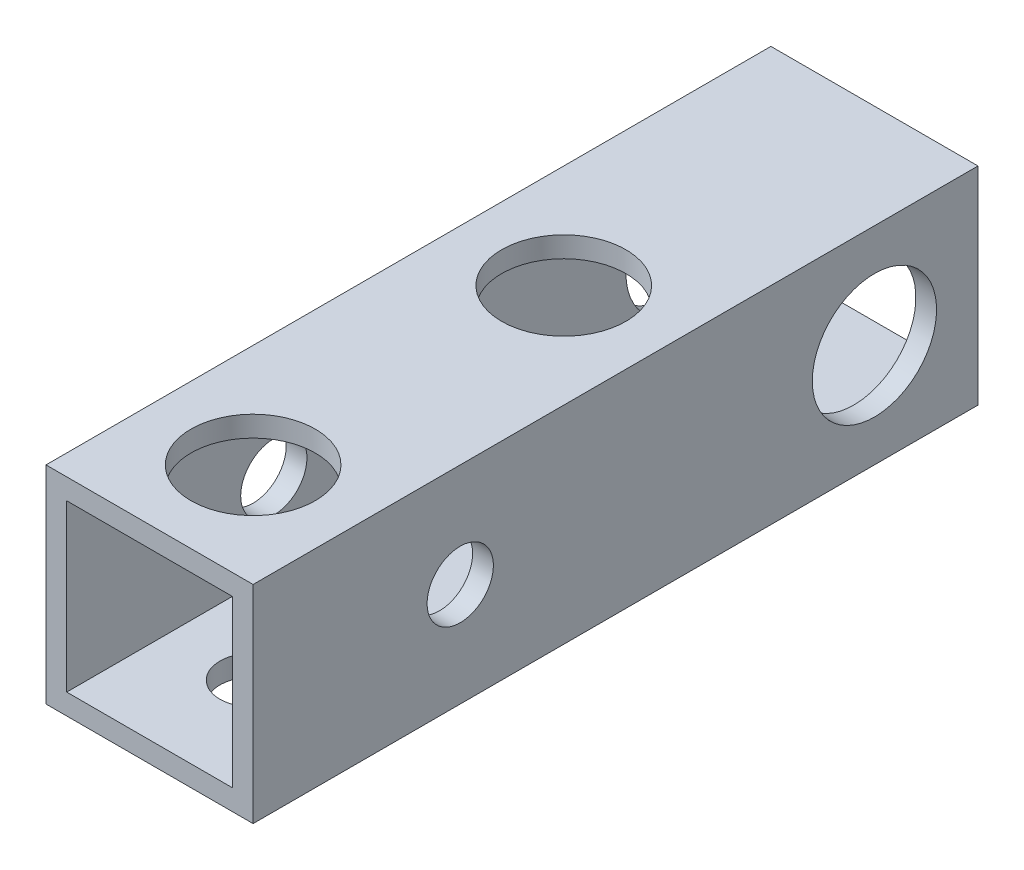
ISO-10303-21;
HEADER;
FILE_DESCRIPTION(('STEP AP214'),'2;1');
FILE_NAME('part.step','',(''),(''),'','','');
FILE_SCHEMA(('AUTOMOTIVE_DESIGN { 1 0 10303 214 1 1 1 1 }'));
ENDSEC;
DATA;
#1=APPLICATION_CONTEXT('core data for automotive mechanical design processes');
#2=APPLICATION_PROTOCOL_DEFINITION('international standard','automotive_design',2000,#1);
#3=PRODUCT_CONTEXT('',#1,'mechanical');
#4=PRODUCT('Part','Part','',(#3));
#5=PRODUCT_RELATED_PRODUCT_CATEGORY('part','',(#4));
#6=PRODUCT_DEFINITION_FORMATION('','',#4);
#7=PRODUCT_DEFINITION_CONTEXT('part definition',#1,'design');
#8=PRODUCT_DEFINITION('design','',#6,#7);
#9=PRODUCT_DEFINITION_SHAPE('','',#8);
#10=(LENGTH_UNIT() NAMED_UNIT(*) SI_UNIT(.MILLI.,.METRE.));
#11=(NAMED_UNIT(*) PLANE_ANGLE_UNIT() SI_UNIT($,.RADIAN.));
#12=(NAMED_UNIT(*) SI_UNIT($,.STERADIAN.) SOLID_ANGLE_UNIT());
#13=UNCERTAINTY_MEASURE_WITH_UNIT(LENGTH_MEASURE(1.E-05),#10,'distance_accuracy_value','');
#14=(GEOMETRIC_REPRESENTATION_CONTEXT(3) GLOBAL_UNCERTAINTY_ASSIGNED_CONTEXT((#13)) GLOBAL_UNIT_ASSIGNED_CONTEXT((#10,
#11,#12)) REPRESENTATION_CONTEXT('',''));
#15=CARTESIAN_POINT('',(0.,0.,0.));
#16=DIRECTION('',(0.,0.,1.));
#17=DIRECTION('',(1.,0.,0.));
#18=AXIS2_PLACEMENT_3D('',#15,#16,#17);
#19=CARTESIAN_POINT('',(0.,0.,0.));
#20=DIRECTION('',(0.,0.,-1.));
#21=DIRECTION('',(-1.,0.,0.));
#22=AXIS2_PLACEMENT_3D('',#19,#20,#21);
#23=PLANE('',#22);
#24=DIRECTION('',(0.,1.,0.));
#25=VECTOR('',#24,1.);
#26=CARTESIAN_POINT('',(5.,-5.,0.));
#27=LINE('',#26,#25);
#28=CARTESIAN_POINT('',(5.,-5.,0.));
#29=VERTEX_POINT('',#28);
#30=CARTESIAN_POINT('',(5.,5.,0.));
#31=VERTEX_POINT('',#30);
#32=EDGE_CURVE('E194',#29,#31,#27,.T.);
#33=ORIENTED_EDGE('',*,*,#32,.F.);
#34=DIRECTION('',(1.,0.,0.));
#35=VECTOR('',#34,1.);
#36=CARTESIAN_POINT('',(-5.,-5.,0.));
#37=LINE('',#36,#35);
#38=CARTESIAN_POINT('',(-5.,-5.,0.));
#39=VERTEX_POINT('',#38);
#40=EDGE_CURVE('E114',#39,#29,#37,.T.);
#41=ORIENTED_EDGE('',*,*,#40,.F.);
#42=DIRECTION('',(0.,-1.,0.));
#43=VECTOR('',#42,1.);
#44=CARTESIAN_POINT('',(-5.,-5.,0.));
#45=LINE('',#44,#43);
#46=CARTESIAN_POINT('',(-5.,5.,0.));
#47=VERTEX_POINT('',#46);
#48=EDGE_CURVE('E120',#47,#39,#45,.T.);
#49=ORIENTED_EDGE('',*,*,#48,.F.);
#50=DIRECTION('',(-1.,0.,0.));
#51=VECTOR('',#50,1.);
#52=CARTESIAN_POINT('',(-5.,5.,0.));
#53=LINE('',#52,#51);
#54=EDGE_CURVE('E196',#31,#47,#53,.T.);
#55=ORIENTED_EDGE('',*,*,#54,.F.);
#56=EDGE_LOOP('',(#33,#41,#49,#55));
#57=FACE_BOUND('',#56,.T.);
#58=DIRECTION('',(-1.,0.,0.));
#59=VECTOR('',#58,1.);
#60=CARTESIAN_POINT('',(4.,4.,0.));
#61=LINE('',#60,#59);
#62=CARTESIAN_POINT('',(4.,4.,0.));
#63=VERTEX_POINT('',#62);
#64=CARTESIAN_POINT('',(-4.,4.,0.));
#65=VERTEX_POINT('',#64);
#66=EDGE_CURVE('E183',#63,#65,#61,.T.);
#67=ORIENTED_EDGE('',*,*,#66,.T.);
#68=DIRECTION('',(0.,-1.,0.));
#69=VECTOR('',#68,1.);
#70=CARTESIAN_POINT('',(-4.,-4.,0.));
#71=LINE('',#70,#69);
#72=CARTESIAN_POINT('',(-4.,-4.,0.));
#73=VERTEX_POINT('',#72);
#74=EDGE_CURVE('E174',#65,#73,#71,.T.);
#75=ORIENTED_EDGE('',*,*,#74,.T.);
#76=DIRECTION('',(1.,0.,0.));
#77=VECTOR('',#76,1.);
#78=CARTESIAN_POINT('',(4.,-4.,0.));
#79=LINE('',#78,#77);
#80=CARTESIAN_POINT('',(4.,-4.,0.));
#81=VERTEX_POINT('',#80);
#82=EDGE_CURVE('E177',#73,#81,#79,.T.);
#83=ORIENTED_EDGE('',*,*,#82,.T.);
#84=DIRECTION('',(0.,1.,0.));
#85=VECTOR('',#84,1.);
#86=CARTESIAN_POINT('',(4.,-4.,0.));
#87=LINE('',#86,#85);
#88=EDGE_CURVE('E180',#81,#63,#87,.T.);
#89=ORIENTED_EDGE('',*,*,#88,.T.);
#90=EDGE_LOOP('',(#67,#75,#83,#89));
#91=FACE_BOUND('',#90,.T.);
#92=ADVANCED_FACE('F34',(#57,#91),#23,.T.);
#93=CARTESIAN_POINT('',(5.,-5.,80.));
#94=DIRECTION('',(-1.,0.,0.));
#95=DIRECTION('',(0.,0.,1.));
#96=AXIS2_PLACEMENT_3D('',#93,#94,#95);
#97=PLANE('',#96);
#98=CARTESIAN_POINT('',(5.,0.,25.));
#99=DIRECTION('',(-1.,0.,0.));
#100=DIRECTION('',(0.,0.,1.));
#101=AXIS2_PLACEMENT_3D('',#98,#99,#100);
#102=CIRCLE('',#101,1.6);
#103=CARTESIAN_POINT('',(5.,0.,26.6));
#104=VERTEX_POINT('',#103);
#105=EDGE_CURVE('E139',#104,#104,#102,.T.);
#106=ORIENTED_EDGE('',*,*,#105,.T.);
#107=EDGE_LOOP('',(#106));
#108=FACE_BOUND('',#107,.T.);
#109=CARTESIAN_POINT('',(5.,0.,5.));
#110=DIRECTION('',(-1.,0.,0.));
#111=DIRECTION('',(0.,0.,1.));
#112=AXIS2_PLACEMENT_3D('',#109,#110,#111);
#113=CIRCLE('',#112,3.);
#114=CARTESIAN_POINT('',(5.,0.,8.));
#115=VERTEX_POINT('',#114);
#116=EDGE_CURVE('E130',#115,#115,#113,.T.);
#117=ORIENTED_EDGE('',*,*,#116,.T.);
#118=EDGE_LOOP('',(#117));
#119=FACE_BOUND('',#118,.T.);
#120=DIRECTION('',(0.,0.,-1.));
#121=VECTOR('',#120,1.);
#122=CARTESIAN_POINT('',(5.,5.,80.));
#123=LINE('',#122,#121);
#124=CARTESIAN_POINT('',(5.,5.,35.));
#125=VERTEX_POINT('',#124);
#126=EDGE_CURVE('E43',#125,#31,#123,.T.);
#127=ORIENTED_EDGE('',*,*,#126,.F.);
#128=DIRECTION('',(0.,1.,0.));
#129=VECTOR('',#128,1.);
#130=CARTESIAN_POINT('',(5.,-5.,35.));
#131=LINE('',#130,#129);
#132=CARTESIAN_POINT('',(5.,-5.,35.));
#133=VERTEX_POINT('',#132);
#134=EDGE_CURVE('E99',#133,#125,#131,.T.);
#135=ORIENTED_EDGE('',*,*,#134,.F.);
#136=DIRECTION('',(0.,0.,-1.));
#137=VECTOR('',#136,1.);
#138=CARTESIAN_POINT('',(5.,-5.,80.));
#139=LINE('',#138,#137);
#140=EDGE_CURVE('E109',#133,#29,#139,.T.);
#141=ORIENTED_EDGE('',*,*,#140,.T.);
#142=ORIENTED_EDGE('',*,*,#32,.T.);
#143=EDGE_LOOP('',(#127,#135,#141,#142));
#144=FACE_BOUND('',#143,.T.);
#145=ADVANCED_FACE('F36',(#108,#119,#144),#97,.F.);
#146=CARTESIAN_POINT('',(-5.,5.,80.));
#147=DIRECTION('',(0.,-1.,0.));
#148=DIRECTION('',(0.,0.,-1.));
#149=AXIS2_PLACEMENT_3D('',#146,#147,#148);
#150=PLANE('',#149);
#151=CARTESIAN_POINT('',(0.,5.,30.));
#152=DIRECTION('',(0.,1.,0.));
#153=DIRECTION('',(0.,0.,1.));
#154=AXIS2_PLACEMENT_3D('',#151,#152,#153);
#155=CIRCLE('',#154,3.);
#156=CARTESIAN_POINT('',(0.,5.,33.));
#157=VERTEX_POINT('',#156);
#158=EDGE_CURVE('E210',#157,#157,#155,.T.);
#159=ORIENTED_EDGE('',*,*,#158,.F.);
#160=EDGE_LOOP('',(#159));
#161=FACE_BOUND('',#160,.T.);
#162=CARTESIAN_POINT('',(0.,5.,15.));
#163=DIRECTION('',(0.,1.,0.));
#164=DIRECTION('',(0.,0.,1.));
#165=AXIS2_PLACEMENT_3D('',#162,#163,#164);
#166=CIRCLE('',#165,3.);
#167=CARTESIAN_POINT('',(0.,5.,18.));
#168=VERTEX_POINT('',#167);
#169=EDGE_CURVE('E160',#168,#168,#166,.T.);
#170=ORIENTED_EDGE('',*,*,#169,.F.);
#171=EDGE_LOOP('',(#170));
#172=FACE_BOUND('',#171,.T.);
#173=DIRECTION('',(0.,0.,-1.));
#174=VECTOR('',#173,1.);
#175=CARTESIAN_POINT('',(-5.,5.,80.));
#176=LINE('',#175,#174);
#177=CARTESIAN_POINT('',(-5.,5.,35.));
#178=VERTEX_POINT('',#177);
#179=EDGE_CURVE('E118',#178,#47,#176,.T.);
#180=ORIENTED_EDGE('',*,*,#179,.F.);
#181=DIRECTION('',(-1.,0.,0.));
#182=VECTOR('',#181,1.);
#183=CARTESIAN_POINT('',(5.,5.,35.));
#184=LINE('',#183,#182);
#185=EDGE_CURVE('E104',#125,#178,#184,.T.);
#186=ORIENTED_EDGE('',*,*,#185,.F.);
#187=ORIENTED_EDGE('',*,*,#126,.T.);
#188=ORIENTED_EDGE('',*,*,#54,.T.);
#189=EDGE_LOOP('',(#180,#186,#187,#188));
#190=FACE_BOUND('',#189,.T.);
#191=ADVANCED_FACE('F207',(#161,#172,#190),#150,.F.);
#192=CARTESIAN_POINT('',(-5.,-5.,80.));
#193=DIRECTION('',(1.,0.,0.));
#194=DIRECTION('',(0.,0.,-1.));
#195=AXIS2_PLACEMENT_3D('',#192,#193,#194);
#196=PLANE('',#195);
#197=CARTESIAN_POINT('',(-5.,0.,25.));
#198=DIRECTION('',(-1.,0.,0.));
#199=DIRECTION('',(0.,0.,1.));
#200=AXIS2_PLACEMENT_3D('',#197,#198,#199);
#201=CIRCLE('',#200,1.6);
#202=CARTESIAN_POINT('',(-5.,0.,26.6));
#203=VERTEX_POINT('',#202);
#204=EDGE_CURVE('E146',#203,#203,#201,.T.);
#205=ORIENTED_EDGE('',*,*,#204,.F.);
#206=EDGE_LOOP('',(#205));
#207=FACE_BOUND('',#206,.T.);
#208=CARTESIAN_POINT('',(-5.,0.,5.));
#209=DIRECTION('',(-1.,0.,0.));
#210=DIRECTION('',(0.,0.,1.));
#211=AXIS2_PLACEMENT_3D('',#208,#209,#210);
#212=CIRCLE('',#211,3.);
#213=CARTESIAN_POINT('',(-5.,0.,8.));
#214=VERTEX_POINT('',#213);
#215=EDGE_CURVE('E167',#214,#214,#212,.T.);
#216=ORIENTED_EDGE('',*,*,#215,.F.);
#217=EDGE_LOOP('',(#216));
#218=FACE_BOUND('',#217,.T.);
#219=DIRECTION('',(0.,0.,-1.));
#220=VECTOR('',#219,1.);
#221=CARTESIAN_POINT('',(-5.,-5.,80.));
#222=LINE('',#221,#220);
#223=CARTESIAN_POINT('',(-5.,-5.,35.));
#224=VERTEX_POINT('',#223);
#225=EDGE_CURVE('E116',#224,#39,#222,.T.);
#226=ORIENTED_EDGE('',*,*,#225,.F.);
#227=DIRECTION('',(0.,1.,0.));
#228=VECTOR('',#227,1.);
#229=CARTESIAN_POINT('',(-5.,-5.,35.));
#230=LINE('',#229,#228);
#231=EDGE_CURVE('E50',#224,#178,#230,.T.);
#232=ORIENTED_EDGE('',*,*,#231,.T.);
#233=ORIENTED_EDGE('',*,*,#179,.T.);
#234=ORIENTED_EDGE('',*,*,#48,.T.);
#235=EDGE_LOOP('',(#226,#232,#233,#234));
#236=FACE_BOUND('',#235,.T.);
#237=ADVANCED_FACE('F201',(#207,#218,#236),#196,.F.);
#238=CARTESIAN_POINT('',(-5.,-5.,80.));
#239=DIRECTION('',(0.,1.,0.));
#240=DIRECTION('',(0.,0.,1.));
#241=AXIS2_PLACEMENT_3D('',#238,#239,#240);
#242=PLANE('',#241);
#243=CARTESIAN_POINT('',(0.,-5.,30.));
#244=DIRECTION('',(0.,1.,0.));
#245=DIRECTION('',(0.,0.,1.));
#246=AXIS2_PLACEMENT_3D('',#243,#244,#245);
#247=CIRCLE('',#246,1.6);
#248=CARTESIAN_POINT('',(0.,-5.,31.6));
#249=VERTEX_POINT('',#248);
#250=EDGE_CURVE('E143',#249,#249,#247,.T.);
#251=ORIENTED_EDGE('',*,*,#250,.T.);
#252=EDGE_LOOP('',(#251));
#253=FACE_BOUND('',#252,.T.);
#254=CARTESIAN_POINT('',(0.,-5.,15.));
#255=DIRECTION('',(0.,1.,0.));
#256=DIRECTION('',(0.,0.,1.));
#257=AXIS2_PLACEMENT_3D('',#254,#255,#256);
#258=CIRCLE('',#257,3.);
#259=CARTESIAN_POINT('',(0.,-5.,18.));
#260=VERTEX_POINT('',#259);
#261=EDGE_CURVE('E135',#260,#260,#258,.T.);
#262=ORIENTED_EDGE('',*,*,#261,.T.);
#263=EDGE_LOOP('',(#262));
#264=FACE_BOUND('',#263,.T.);
#265=ORIENTED_EDGE('',*,*,#140,.F.);
#266=DIRECTION('',(-1.,0.,0.));
#267=VECTOR('',#266,1.);
#268=CARTESIAN_POINT('',(5.,-5.,35.));
#269=LINE('',#268,#267);
#270=EDGE_CURVE('E96',#133,#224,#269,.T.);
#271=ORIENTED_EDGE('',*,*,#270,.T.);
#272=ORIENTED_EDGE('',*,*,#225,.T.);
#273=ORIENTED_EDGE('',*,*,#40,.T.);
#274=EDGE_LOOP('',(#265,#271,#272,#273));
#275=FACE_BOUND('',#274,.T.);
#276=ADVANCED_FACE('F112',(#253,#264,#275),#242,.F.);
#277=CARTESIAN_POINT('',(-4.,-4.,80.));
#278=DIRECTION('',(1.,0.,0.));
#279=DIRECTION('',(0.,1.,0.));
#280=AXIS2_PLACEMENT_3D('',#277,#278,#279);
#281=PLANE('',#280);
#282=DIRECTION('',(0.,1.,0.));
#283=VECTOR('',#282,1.);
#284=CARTESIAN_POINT('',(-4.,-4.,35.));
#285=LINE('',#284,#283);
#286=CARTESIAN_POINT('',(-4.,-4.,35.));
#287=VERTEX_POINT('',#286);
#288=CARTESIAN_POINT('',(-4.,4.,35.));
#289=VERTEX_POINT('',#288);
#290=EDGE_CURVE('E57',#287,#289,#285,.T.);
#291=ORIENTED_EDGE('',*,*,#290,.F.);
#292=DIRECTION('',(0.,0.,-1.));
#293=VECTOR('',#292,1.);
#294=CARTESIAN_POINT('',(-4.,-4.,80.));
#295=LINE('',#294,#293);
#296=EDGE_CURVE('E192',#287,#73,#295,.T.);
#297=ORIENTED_EDGE('',*,*,#296,.T.);
#298=ORIENTED_EDGE('',*,*,#74,.F.);
#299=DIRECTION('',(0.,0.,-1.));
#300=VECTOR('',#299,1.);
#301=CARTESIAN_POINT('',(-4.,4.,80.));
#302=LINE('',#301,#300);
#303=EDGE_CURVE('E186',#289,#65,#302,.T.);
#304=ORIENTED_EDGE('',*,*,#303,.F.);
#305=EDGE_LOOP('',(#291,#297,#298,#304));
#306=FACE_BOUND('',#305,.T.);
#307=CARTESIAN_POINT('',(-4.,0.,25.));
#308=DIRECTION('',(1.,0.,0.));
#309=DIRECTION('',(0.,1.,0.));
#310=AXIS2_PLACEMENT_3D('',#307,#308,#309);
#311=CIRCLE('',#310,1.6);
#312=CARTESIAN_POINT('',(-4.,1.6,25.));
#313=VERTEX_POINT('',#312);
#314=EDGE_CURVE('E138',#313,#313,#311,.T.);
#315=ORIENTED_EDGE('',*,*,#314,.F.);
#316=EDGE_LOOP('',(#315));
#317=FACE_BOUND('',#316,.T.);
#318=CARTESIAN_POINT('',(-4.,0.,5.));
#319=DIRECTION('',(1.,0.,0.));
#320=DIRECTION('',(0.,1.,0.));
#321=AXIS2_PLACEMENT_3D('',#318,#319,#320);
#322=CIRCLE('',#321,3.);
#323=CARTESIAN_POINT('',(-4.,3.,5.));
#324=VERTEX_POINT('',#323);
#325=EDGE_CURVE('E129',#324,#324,#322,.T.);
#326=ORIENTED_EDGE('',*,*,#325,.F.);
#327=EDGE_LOOP('',(#326));
#328=FACE_BOUND('',#327,.T.);
#329=ADVANCED_FACE('F223',(#306,#317,#328),#281,.T.);
#330=CARTESIAN_POINT('',(4.,-4.,80.));
#331=DIRECTION('',(0.,1.,0.));
#332=DIRECTION('',(-1.,0.,0.));
#333=AXIS2_PLACEMENT_3D('',#330,#331,#332);
#334=PLANE('',#333);
#335=DIRECTION('',(-1.,0.,0.));
#336=VECTOR('',#335,1.);
#337=CARTESIAN_POINT('',(4.,-4.,35.));
#338=LINE('',#337,#336);
#339=CARTESIAN_POINT('',(4.,-4.,35.));
#340=VERTEX_POINT('',#339);
#341=EDGE_CURVE('E215',#340,#287,#338,.T.);
#342=ORIENTED_EDGE('',*,*,#341,.F.);
#343=DIRECTION('',(0.,0.,-1.));
#344=VECTOR('',#343,1.);
#345=CARTESIAN_POINT('',(4.,-4.,80.));
#346=LINE('',#345,#344);
#347=EDGE_CURVE('E190',#340,#81,#346,.T.);
#348=ORIENTED_EDGE('',*,*,#347,.T.);
#349=ORIENTED_EDGE('',*,*,#82,.F.);
#350=ORIENTED_EDGE('',*,*,#296,.F.);
#351=EDGE_LOOP('',(#342,#348,#349,#350));
#352=FACE_BOUND('',#351,.T.);
#353=CARTESIAN_POINT('',(0.,-4.,30.));
#354=DIRECTION('',(0.,1.,0.));
#355=DIRECTION('',(-1.,0.,0.));
#356=AXIS2_PLACEMENT_3D('',#353,#354,#355);
#357=CIRCLE('',#356,1.6);
#358=CARTESIAN_POINT('',(-1.6,-4.,30.));
#359=VERTEX_POINT('',#358);
#360=EDGE_CURVE('E157',#359,#359,#357,.T.);
#361=ORIENTED_EDGE('',*,*,#360,.F.);
#362=EDGE_LOOP('',(#361));
#363=FACE_BOUND('',#362,.T.);
#364=CARTESIAN_POINT('',(0.,-4.,15.));
#365=DIRECTION('',(0.,1.,0.));
#366=DIRECTION('',(-1.,0.,0.));
#367=AXIS2_PLACEMENT_3D('',#364,#365,#366);
#368=CIRCLE('',#367,3.);
#369=CARTESIAN_POINT('',(-3.,-4.,15.));
#370=VERTEX_POINT('',#369);
#371=EDGE_CURVE('E134',#370,#370,#368,.T.);
#372=ORIENTED_EDGE('',*,*,#371,.F.);
#373=EDGE_LOOP('',(#372));
#374=FACE_BOUND('',#373,.T.);
#375=ADVANCED_FACE('F227',(#352,#363,#374),#334,.T.);
#376=CARTESIAN_POINT('',(4.,-4.,80.));
#377=DIRECTION('',(-1.,0.,0.));
#378=DIRECTION('',(0.,0.,1.));
#379=AXIS2_PLACEMENT_3D('',#376,#377,#378);
#380=PLANE('',#379);
#381=DIRECTION('',(0.,-1.,0.));
#382=VECTOR('',#381,1.);
#383=CARTESIAN_POINT('',(4.,-4.,35.));
#384=LINE('',#383,#382);
#385=CARTESIAN_POINT('',(4.,4.,35.));
#386=VERTEX_POINT('',#385);
#387=EDGE_CURVE('E213',#386,#340,#384,.T.);
#388=ORIENTED_EDGE('',*,*,#387,.F.);
#389=DIRECTION('',(0.,0.,-1.));
#390=VECTOR('',#389,1.);
#391=CARTESIAN_POINT('',(4.,4.,80.));
#392=LINE('',#391,#390);
#393=EDGE_CURVE('E188',#386,#63,#392,.T.);
#394=ORIENTED_EDGE('',*,*,#393,.T.);
#395=ORIENTED_EDGE('',*,*,#88,.F.);
#396=ORIENTED_EDGE('',*,*,#347,.F.);
#397=EDGE_LOOP('',(#388,#394,#395,#396));
#398=FACE_BOUND('',#397,.T.);
#399=CARTESIAN_POINT('',(4.,0.,25.));
#400=DIRECTION('',(-1.,0.,0.));
#401=DIRECTION('',(0.,0.,1.));
#402=AXIS2_PLACEMENT_3D('',#399,#400,#401);
#403=CIRCLE('',#402,1.6);
#404=CARTESIAN_POINT('',(4.,0.,26.6));
#405=VERTEX_POINT('',#404);
#406=EDGE_CURVE('E136',#405,#405,#403,.T.);
#407=ORIENTED_EDGE('',*,*,#406,.F.);
#408=EDGE_LOOP('',(#407));
#409=FACE_BOUND('',#408,.T.);
#410=CARTESIAN_POINT('',(4.,0.,5.));
#411=DIRECTION('',(-1.,0.,0.));
#412=DIRECTION('',(0.,0.,1.));
#413=AXIS2_PLACEMENT_3D('',#410,#411,#412);
#414=CIRCLE('',#413,3.);
#415=CARTESIAN_POINT('',(4.,0.,8.));
#416=VERTEX_POINT('',#415);
#417=EDGE_CURVE('E126',#416,#416,#414,.T.);
#418=ORIENTED_EDGE('',*,*,#417,.F.);
#419=EDGE_LOOP('',(#418));
#420=FACE_BOUND('',#419,.T.);
#421=ADVANCED_FACE('F236',(#398,#409,#420),#380,.T.);
#422=CARTESIAN_POINT('',(4.,4.,80.));
#423=DIRECTION('',(0.,-1.,0.));
#424=DIRECTION('',(1.,0.,0.));
#425=AXIS2_PLACEMENT_3D('',#422,#423,#424);
#426=PLANE('',#425);
#427=CARTESIAN_POINT('',(0.,4.,30.));
#428=DIRECTION('',(0.,-1.,0.));
#429=DIRECTION('',(1.,0.,0.));
#430=AXIS2_PLACEMENT_3D('',#427,#428,#429);
#431=CIRCLE('',#430,3.);
#432=CARTESIAN_POINT('',(3.,4.,30.));
#433=VERTEX_POINT('',#432);
#434=EDGE_CURVE('E38',#433,#433,#431,.T.);
#435=ORIENTED_EDGE('',*,*,#434,.F.);
#436=EDGE_LOOP('',(#435));
#437=FACE_BOUND('',#436,.T.);
#438=DIRECTION('',(1.,0.,0.));
#439=VECTOR('',#438,1.);
#440=CARTESIAN_POINT('',(4.,4.,35.));
#441=LINE('',#440,#439);
#442=EDGE_CURVE('E11',#289,#386,#441,.T.);
#443=ORIENTED_EDGE('',*,*,#442,.F.);
#444=ORIENTED_EDGE('',*,*,#303,.T.);
#445=ORIENTED_EDGE('',*,*,#66,.F.);
#446=ORIENTED_EDGE('',*,*,#393,.F.);
#447=EDGE_LOOP('',(#443,#444,#445,#446));
#448=FACE_BOUND('',#447,.T.);
#449=CARTESIAN_POINT('',(0.,4.,15.));
#450=DIRECTION('',(0.,-1.,0.));
#451=DIRECTION('',(1.,0.,0.));
#452=AXIS2_PLACEMENT_3D('',#449,#450,#451);
#453=CIRCLE('',#452,3.);
#454=CARTESIAN_POINT('',(3.,4.,15.));
#455=VERTEX_POINT('',#454);
#456=EDGE_CURVE('E131',#455,#455,#453,.T.);
#457=ORIENTED_EDGE('',*,*,#456,.F.);
#458=EDGE_LOOP('',(#457));
#459=FACE_BOUND('',#458,.T.);
#460=ADVANCED_FACE('F233',(#437,#448,#459),#426,.T.);
#461=CARTESIAN_POINT('',(5.,0.,5.));
#462=DIRECTION('',(-1.,0.,0.));
#463=DIRECTION('',(0.,0.,1.));
#464=AXIS2_PLACEMENT_3D('',#461,#462,#463);
#465=CYLINDRICAL_SURFACE('',#464,3.);
#466=ORIENTED_EDGE('',*,*,#417,.T.);
#467=EDGE_LOOP('',(#466));
#468=FACE_BOUND('',#467,.T.);
#469=ORIENTED_EDGE('',*,*,#116,.F.);
#470=EDGE_LOOP('',(#469));
#471=FACE_BOUND('',#470,.T.);
#472=ADVANCED_FACE('F243',(#468,#471),#465,.F.);
#473=ORIENTED_EDGE('',*,*,#325,.T.);
#474=EDGE_LOOP('',(#473));
#475=FACE_BOUND('',#474,.T.);
#476=ORIENTED_EDGE('',*,*,#215,.T.);
#477=EDGE_LOOP('',(#476));
#478=FACE_BOUND('',#477,.T.);
#479=ADVANCED_FACE('F246',(#475,#478),#465,.F.);
#480=CARTESIAN_POINT('',(0.,-5.,15.));
#481=DIRECTION('',(0.,1.,0.));
#482=DIRECTION('',(0.,0.,1.));
#483=AXIS2_PLACEMENT_3D('',#480,#481,#482);
#484=CYLINDRICAL_SURFACE('',#483,3.);
#485=ORIENTED_EDGE('',*,*,#456,.T.);
#486=EDGE_LOOP('',(#485));
#487=FACE_BOUND('',#486,.T.);
#488=ORIENTED_EDGE('',*,*,#169,.T.);
#489=EDGE_LOOP('',(#488));
#490=FACE_BOUND('',#489,.T.);
#491=ADVANCED_FACE('F274',(#487,#490),#484,.F.);
#492=ORIENTED_EDGE('',*,*,#371,.T.);
#493=EDGE_LOOP('',(#492));
#494=FACE_BOUND('',#493,.T.);
#495=ORIENTED_EDGE('',*,*,#261,.F.);
#496=EDGE_LOOP('',(#495));
#497=FACE_BOUND('',#496,.T.);
#498=ADVANCED_FACE('F279',(#494,#497),#484,.F.);
#499=CARTESIAN_POINT('',(0.,-5.,30.));
#500=DIRECTION('',(0.,1.,0.));
#501=DIRECTION('',(0.,0.,1.));
#502=AXIS2_PLACEMENT_3D('',#499,#500,#501);
#503=CYLINDRICAL_SURFACE('',#502,1.6);
#504=ORIENTED_EDGE('',*,*,#360,.T.);
#505=EDGE_LOOP('',(#504));
#506=FACE_BOUND('',#505,.T.);
#507=ORIENTED_EDGE('',*,*,#250,.F.);
#508=EDGE_LOOP('',(#507));
#509=FACE_BOUND('',#508,.T.);
#510=ADVANCED_FACE('F328',(#506,#509),#503,.F.);
#511=CARTESIAN_POINT('',(5.,0.,25.));
#512=DIRECTION('',(-1.,0.,0.));
#513=DIRECTION('',(0.,0.,1.));
#514=AXIS2_PLACEMENT_3D('',#511,#512,#513);
#515=CYLINDRICAL_SURFACE('',#514,1.6);
#516=ORIENTED_EDGE('',*,*,#406,.T.);
#517=EDGE_LOOP('',(#516));
#518=FACE_BOUND('',#517,.T.);
#519=ORIENTED_EDGE('',*,*,#105,.F.);
#520=EDGE_LOOP('',(#519));
#521=FACE_BOUND('',#520,.T.);
#522=ADVANCED_FACE('F316',(#518,#521),#515,.F.);
#523=ORIENTED_EDGE('',*,*,#314,.T.);
#524=EDGE_LOOP('',(#523));
#525=FACE_BOUND('',#524,.T.);
#526=ORIENTED_EDGE('',*,*,#204,.T.);
#527=EDGE_LOOP('',(#526));
#528=FACE_BOUND('',#527,.T.);
#529=ADVANCED_FACE('F311',(#525,#528),#515,.F.);
#530=CARTESIAN_POINT('',(5.,-5.,35.));
#531=DIRECTION('',(0.,0.,-1.));
#532=DIRECTION('',(-1.,0.,0.));
#533=AXIS2_PLACEMENT_3D('',#530,#531,#532);
#534=PLANE('',#533);
#535=ORIENTED_EDGE('',*,*,#290,.T.);
#536=ORIENTED_EDGE('',*,*,#442,.T.);
#537=ORIENTED_EDGE('',*,*,#387,.T.);
#538=ORIENTED_EDGE('',*,*,#341,.T.);
#539=EDGE_LOOP('',(#535,#536,#537,#538));
#540=FACE_BOUND('',#539,.T.);
#541=ORIENTED_EDGE('',*,*,#185,.T.);
#542=ORIENTED_EDGE('',*,*,#231,.F.);
#543=ORIENTED_EDGE('',*,*,#270,.F.);
#544=ORIENTED_EDGE('',*,*,#134,.T.);
#545=EDGE_LOOP('',(#541,#542,#543,#544));
#546=FACE_BOUND('',#545,.T.);
#547=ADVANCED_FACE('F98',(#540,#546),#534,.F.);
#548=CARTESIAN_POINT('',(0.,3.,30.));
#549=DIRECTION('',(0.,1.,0.));
#550=DIRECTION('',(0.,0.,1.));
#551=AXIS2_PLACEMENT_3D('',#548,#549,#550);
#552=CYLINDRICAL_SURFACE('',#551,3.);
#553=ORIENTED_EDGE('',*,*,#434,.T.);
#554=EDGE_LOOP('',(#553));
#555=FACE_BOUND('',#554,.T.);
#556=ORIENTED_EDGE('',*,*,#158,.T.);
#557=EDGE_LOOP('',(#556));
#558=FACE_BOUND('',#557,.T.);
#559=ADVANCED_FACE('F384',(#555,#558),#552,.F.);
#560=CLOSED_SHELL('',(#92,#145,#191,#237,#276,#329,#375,#421,#460,#472,#479,#491,#498,#510,#522,
#529,#547,#559));
#561=MANIFOLD_SOLID_BREP('B2',#560);
#562=ADVANCED_BREP_SHAPE_REPRESENTATION('',(#18,#561),#14);
#563=SHAPE_DEFINITION_REPRESENTATION(#9,#562);
ENDSEC;
END-ISO-10303-21;
